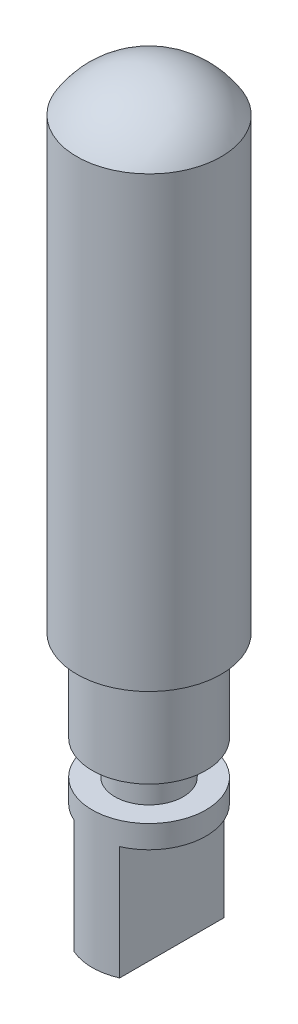
ISO-10303-21;
HEADER;
FILE_DESCRIPTION(('STEP AP214'),'2;1');
FILE_NAME('part.step','',(''),(''),'','','');
FILE_SCHEMA(('AUTOMOTIVE_DESIGN { 1 0 10303 214 1 1 1 1 }'));
ENDSEC;
DATA;
#1=APPLICATION_CONTEXT('core data for automotive mechanical design processes');
#2=APPLICATION_PROTOCOL_DEFINITION('international standard','automotive_design',2000,#1);
#3=PRODUCT_CONTEXT('',#1,'mechanical');
#4=PRODUCT('Part','Part','',(#3));
#5=PRODUCT_RELATED_PRODUCT_CATEGORY('part','',(#4));
#6=PRODUCT_DEFINITION_FORMATION('','',#4);
#7=PRODUCT_DEFINITION_CONTEXT('part definition',#1,'design');
#8=PRODUCT_DEFINITION('design','',#6,#7);
#9=PRODUCT_DEFINITION_SHAPE('','',#8);
#10=(LENGTH_UNIT() NAMED_UNIT(*) SI_UNIT(.MILLI.,.METRE.));
#11=(NAMED_UNIT(*) PLANE_ANGLE_UNIT() SI_UNIT($,.RADIAN.));
#12=(NAMED_UNIT(*) SI_UNIT($,.STERADIAN.) SOLID_ANGLE_UNIT());
#13=UNCERTAINTY_MEASURE_WITH_UNIT(LENGTH_MEASURE(1.E-05),#10,'distance_accuracy_value','');
#14=(GEOMETRIC_REPRESENTATION_CONTEXT(3) GLOBAL_UNCERTAINTY_ASSIGNED_CONTEXT((#13)) GLOBAL_UNIT_ASSIGNED_CONTEXT((#10,
#11,#12)) REPRESENTATION_CONTEXT('',''));
#15=CARTESIAN_POINT('',(0.,0.,0.));
#16=DIRECTION('',(0.,0.,1.));
#17=DIRECTION('',(1.,0.,0.));
#18=AXIS2_PLACEMENT_3D('',#15,#16,#17);
#19=CARTESIAN_POINT('',(0.,-6.5,0.));
#20=DIRECTION('',(0.,-1.,0.));
#21=DIRECTION('',(0.,0.,-1.));
#22=AXIS2_PLACEMENT_3D('',#19,#20,#21);
#23=PLANE('',#22);
#24=CARTESIAN_POINT('',(0.,-6.5,0.));
#25=DIRECTION('',(0.,-1.,0.));
#26=DIRECTION('',(0.,0.,-1.));
#27=AXIS2_PLACEMENT_3D('',#24,#25,#26);
#28=CIRCLE('',#27,2.5);
#29=CARTESIAN_POINT('',(-0.999999999999986,-6.5,-2.29128784747793));
#30=VERTEX_POINT('',#29);
#31=CARTESIAN_POINT('',(-0.999999999999985,-6.5,2.29128784747793));
#32=VERTEX_POINT('',#31);
#33=EDGE_CURVE('E75',#30,#32,#28,.F.);
#34=ORIENTED_EDGE('',*,*,#33,.F.);
#35=DIRECTION('',(0.,0.,-1.));
#36=VECTOR('',#35,1.);
#37=CARTESIAN_POINT('',(-1.,-6.5,-2.291287847478));
#38=LINE('',#37,#36);
#39=EDGE_CURVE('E67',#30,#32,#38,.F.);
#40=ORIENTED_EDGE('',*,*,#39,.T.);
#41=EDGE_LOOP('',(#34,#40));
#42=FACE_BOUND('',#41,.T.);
#43=ADVANCED_FACE('F17',(#42),#23,.T.);
#44=CARTESIAN_POINT('',(-1.,-11.5,-2.291287847478));
#45=DIRECTION('',(1.,0.,0.));
#46=DIRECTION('',(0.,0.,-1.));
#47=AXIS2_PLACEMENT_3D('',#44,#45,#46);
#48=PLANE('',#47);
#49=DIRECTION('',(0.,-1.,0.));
#50=VECTOR('',#49,1.);
#51=CARTESIAN_POINT('',(-0.99999999999997,23.15,2.29128784747793));
#52=LINE('',#51,#50);
#53=CARTESIAN_POINT('',(-0.999999999999985,-11.5,2.29128784747793));
#54=VERTEX_POINT('',#53);
#55=EDGE_CURVE('E105',#32,#54,#52,.T.);
#56=ORIENTED_EDGE('',*,*,#55,.F.);
#57=ORIENTED_EDGE('',*,*,#39,.F.);
#58=DIRECTION('',(0.,-1.,0.));
#59=VECTOR('',#58,1.);
#60=CARTESIAN_POINT('',(-0.999999999999972,23.15,-2.29128784747793));
#61=LINE('',#60,#59);
#62=CARTESIAN_POINT('',(-0.999999999999986,-11.5,-2.29128784747793));
#63=VERTEX_POINT('',#62);
#64=EDGE_CURVE('E71',#63,#30,#61,.F.);
#65=ORIENTED_EDGE('',*,*,#64,.F.);
#66=DIRECTION('',(0.,0.,-1.));
#67=VECTOR('',#66,1.);
#68=CARTESIAN_POINT('',(-1.,-11.5,0.));
#69=LINE('',#68,#67);
#70=EDGE_CURVE('E56',#54,#63,#69,.T.);
#71=ORIENTED_EDGE('',*,*,#70,.F.);
#72=EDGE_LOOP('',(#56,#57,#65,#71));
#73=FACE_BOUND('',#72,.T.);
#74=ADVANCED_FACE('F72',(#73),#48,.F.);
#75=CARTESIAN_POINT('',(0.,-11.5,0.));
#76=DIRECTION('',(0.,-1.,0.));
#77=DIRECTION('',(0.,0.,-1.));
#78=AXIS2_PLACEMENT_3D('',#75,#76,#77);
#79=PLANE('',#78);
#80=ORIENTED_EDGE('',*,*,#70,.T.);
#81=CARTESIAN_POINT('',(0.,-11.5,0.));
#82=DIRECTION('',(0.,-1.,0.));
#83=DIRECTION('',(0.,0.,-1.));
#84=AXIS2_PLACEMENT_3D('',#81,#82,#83);
#85=CIRCLE('',#84,2.5);
#86=CARTESIAN_POINT('',(0.999999999999985,-11.5,-2.29128784747793));
#87=VERTEX_POINT('',#86);
#88=EDGE_CURVE('E20',#87,#63,#85,.F.);
#89=ORIENTED_EDGE('',*,*,#88,.F.);
#90=DIRECTION('',(0.,0.,1.));
#91=VECTOR('',#90,1.);
#92=CARTESIAN_POINT('',(1.,-11.5,2.291287847478));
#93=LINE('',#92,#91);
#94=CARTESIAN_POINT('',(0.999999999999985,-11.5,2.29128784747793));
#95=VERTEX_POINT('',#94);
#96=EDGE_CURVE('E66',#87,#95,#93,.T.);
#97=ORIENTED_EDGE('',*,*,#96,.T.);
#98=CARTESIAN_POINT('',(0.,-11.5,0.));
#99=DIRECTION('',(0.,-1.,0.));
#100=DIRECTION('',(0.,0.,-1.));
#101=AXIS2_PLACEMENT_3D('',#98,#99,#100);
#102=CIRCLE('',#101,2.5);
#103=EDGE_CURVE('E62',#54,#95,#102,.F.);
#104=ORIENTED_EDGE('',*,*,#103,.F.);
#105=EDGE_LOOP('',(#80,#89,#97,#104));
#106=FACE_BOUND('',#105,.T.);
#107=ADVANCED_FACE('F58',(#106),#79,.T.);
#108=CARTESIAN_POINT('',(1.,-11.5,2.291287847478));
#109=DIRECTION('',(-1.,0.,0.));
#110=DIRECTION('',(0.,0.,1.));
#111=AXIS2_PLACEMENT_3D('',#108,#109,#110);
#112=PLANE('',#111);
#113=DIRECTION('',(0.,-1.,0.));
#114=VECTOR('',#113,1.);
#115=CARTESIAN_POINT('',(0.99999999999997,23.15,2.29128784747793));
#116=LINE('',#115,#114);
#117=CARTESIAN_POINT('',(0.999999999999985,-6.5,2.29128784747793));
#118=VERTEX_POINT('',#117);
#119=EDGE_CURVE('E104',#95,#118,#116,.F.);
#120=ORIENTED_EDGE('',*,*,#119,.F.);
#121=ORIENTED_EDGE('',*,*,#96,.F.);
#122=DIRECTION('',(0.,-1.,0.));
#123=VECTOR('',#122,1.);
#124=CARTESIAN_POINT('',(0.999999999999971,23.15,-2.29128784747793));
#125=LINE('',#124,#123);
#126=CARTESIAN_POINT('',(0.999999999999985,-6.5,-2.29128784747793));
#127=VERTEX_POINT('',#126);
#128=EDGE_CURVE('E80',#127,#87,#125,.T.);
#129=ORIENTED_EDGE('',*,*,#128,.F.);
#130=DIRECTION('',(0.,0.,-1.));
#131=VECTOR('',#130,1.);
#132=CARTESIAN_POINT('',(1.,-6.5,0.));
#133=LINE('',#132,#131);
#134=EDGE_CURVE('E35',#118,#127,#133,.T.);
#135=ORIENTED_EDGE('',*,*,#134,.F.);
#136=EDGE_LOOP('',(#120,#121,#129,#135));
#137=FACE_BOUND('',#136,.T.);
#138=ADVANCED_FACE('F135',(#137),#112,.F.);
#139=CARTESIAN_POINT('',(0.,-6.5,0.));
#140=DIRECTION('',(0.,-1.,0.));
#141=DIRECTION('',(0.,0.,-1.));
#142=AXIS2_PLACEMENT_3D('',#139,#140,#141);
#143=PLANE('',#142);
#144=ORIENTED_EDGE('',*,*,#134,.T.);
#145=CARTESIAN_POINT('',(0.,-6.5,0.));
#146=DIRECTION('',(0.,-1.,0.));
#147=DIRECTION('',(0.,0.,-1.));
#148=AXIS2_PLACEMENT_3D('',#145,#146,#147);
#149=CIRCLE('',#148,2.5);
#150=EDGE_CURVE('E102',#118,#127,#149,.F.);
#151=ORIENTED_EDGE('',*,*,#150,.F.);
#152=EDGE_LOOP('',(#144,#151));
#153=FACE_BOUND('',#152,.T.);
#154=ADVANCED_FACE('F137',(#153),#143,.T.);
#155=CARTESIAN_POINT('',(0.,23.15,0.));
#156=DIRECTION('',(0.,-1.,0.));
#157=DIRECTION('',(0.,0.,-1.));
#158=AXIS2_PLACEMENT_3D('',#155,#156,#157);
#159=CYLINDRICAL_SURFACE('',#158,2.5);
#160=CARTESIAN_POINT('',(0.,-5.5,0.));
#161=DIRECTION('',(0.,-1.,0.));
#162=DIRECTION('',(0.,0.,-1.));
#163=AXIS2_PLACEMENT_3D('',#160,#161,#162);
#164=CIRCLE('',#163,2.5);
#165=CARTESIAN_POINT('',(0.,-5.5,-2.5));
#166=VERTEX_POINT('',#165);
#167=EDGE_CURVE('E99',#166,#166,#164,.T.);
#168=ORIENTED_EDGE('',*,*,#167,.T.);
#169=EDGE_LOOP('',(#168));
#170=FACE_BOUND('',#169,.T.);
#171=ORIENTED_EDGE('',*,*,#119,.T.);
#172=ORIENTED_EDGE('',*,*,#150,.T.);
#173=ORIENTED_EDGE('',*,*,#128,.T.);
#174=ORIENTED_EDGE('',*,*,#88,.T.);
#175=ORIENTED_EDGE('',*,*,#64,.T.);
#176=ORIENTED_EDGE('',*,*,#33,.T.);
#177=ORIENTED_EDGE('',*,*,#55,.T.);
#178=ORIENTED_EDGE('',*,*,#103,.T.);
#179=EDGE_LOOP('',(#171,#172,#173,#174,#175,#176,#177,#178));
#180=FACE_BOUND('',#179,.T.);
#181=ADVANCED_FACE('F78',(#170,#180),#159,.T.);
#182=CARTESIAN_POINT('',(0.,-5.5,0.));
#183=DIRECTION('',(0.,-1.,0.));
#184=DIRECTION('',(0.,0.,-1.));
#185=AXIS2_PLACEMENT_3D('',#182,#183,#184);
#186=PLANE('',#185);
#187=CARTESIAN_POINT('',(0.,-5.5,0.));
#188=DIRECTION('',(0.,-1.,0.));
#189=DIRECTION('',(0.,0.,-1.));
#190=AXIS2_PLACEMENT_3D('',#187,#188,#189);
#191=CIRCLE('',#190,1.5);
#192=CARTESIAN_POINT('',(0.,-5.5,-1.5));
#193=VERTEX_POINT('',#192);
#194=EDGE_CURVE('E96',#193,#193,#191,.F.);
#195=ORIENTED_EDGE('',*,*,#194,.F.);
#196=EDGE_LOOP('',(#195));
#197=FACE_BOUND('',#196,.T.);
#198=ORIENTED_EDGE('',*,*,#167,.F.);
#199=EDGE_LOOP('',(#198));
#200=FACE_BOUND('',#199,.T.);
#201=ADVANCED_FACE('F144',(#197,#200),#186,.F.);
#202=CARTESIAN_POINT('',(0.,23.15,0.));
#203=DIRECTION('',(0.,-1.,0.));
#204=DIRECTION('',(0.,0.,-1.));
#205=AXIS2_PLACEMENT_3D('',#202,#203,#204);
#206=CYLINDRICAL_SURFACE('',#205,1.5);
#207=ORIENTED_EDGE('',*,*,#194,.T.);
#208=EDGE_LOOP('',(#207));
#209=FACE_BOUND('',#208,.T.);
#210=CARTESIAN_POINT('',(0.,-4.,0.));
#211=DIRECTION('',(0.,-1.,0.));
#212=DIRECTION('',(0.,0.,-1.));
#213=AXIS2_PLACEMENT_3D('',#210,#211,#212);
#214=CIRCLE('',#213,1.5);
#215=CARTESIAN_POINT('',(0.,-4.,-1.5));
#216=VERTEX_POINT('',#215);
#217=EDGE_CURVE('E93',#216,#216,#214,.F.);
#218=ORIENTED_EDGE('',*,*,#217,.F.);
#219=EDGE_LOOP('',(#218));
#220=FACE_BOUND('',#219,.T.);
#221=ADVANCED_FACE('F177',(#209,#220),#206,.T.);
#222=CARTESIAN_POINT('',(0.,-4.,0.));
#223=DIRECTION('',(0.,-1.,0.));
#224=DIRECTION('',(0.,0.,-1.));
#225=AXIS2_PLACEMENT_3D('',#222,#223,#224);
#226=PLANE('',#225);
#227=ORIENTED_EDGE('',*,*,#217,.T.);
#228=EDGE_LOOP('',(#227));
#229=FACE_BOUND('',#228,.T.);
#230=CARTESIAN_POINT('',(0.,-4.,0.));
#231=DIRECTION('',(0.,-1.,0.));
#232=DIRECTION('',(0.,0.,-1.));
#233=AXIS2_PLACEMENT_3D('',#230,#231,#232);
#234=CIRCLE('',#233,2.5);
#235=CARTESIAN_POINT('',(0.,-4.,-2.5));
#236=VERTEX_POINT('',#235);
#237=EDGE_CURVE('E90',#236,#236,#234,.F.);
#238=ORIENTED_EDGE('',*,*,#237,.F.);
#239=EDGE_LOOP('',(#238));
#240=FACE_BOUND('',#239,.T.);
#241=ADVANCED_FACE('F184',(#229,#240),#226,.T.);
#242=CARTESIAN_POINT('',(0.,23.15,0.));
#243=DIRECTION('',(0.,-1.,0.));
#244=DIRECTION('',(0.,0.,-1.));
#245=AXIS2_PLACEMENT_3D('',#242,#243,#244);
#246=CYLINDRICAL_SURFACE('',#245,2.5);
#247=ORIENTED_EDGE('',*,*,#237,.T.);
#248=EDGE_LOOP('',(#247));
#249=FACE_BOUND('',#248,.T.);
#250=CARTESIAN_POINT('',(0.,0.,0.));
#251=DIRECTION('',(0.,-1.,0.));
#252=DIRECTION('',(0.,0.,-1.));
#253=AXIS2_PLACEMENT_3D('',#250,#251,#252);
#254=CIRCLE('',#253,2.5);
#255=CARTESIAN_POINT('',(0.,0.,-2.5));
#256=VERTEX_POINT('',#255);
#257=EDGE_CURVE('E87',#256,#256,#254,.F.);
#258=ORIENTED_EDGE('',*,*,#257,.F.);
#259=EDGE_LOOP('',(#258));
#260=FACE_BOUND('',#259,.T.);
#261=ADVANCED_FACE('F130',(#249,#260),#246,.T.);
#262=CARTESIAN_POINT('',(0.,17.79982638889,0.));
#263=DIRECTION('',(-1.,0.,0.));
#264=DIRECTION('',(0.,0.,-1.));
#265=AXIS2_PLACEMENT_3D('',#262,#263,#264);
#266=SPHERICAL_SURFACE('',#265,3.700173611111);
#267=CARTESIAN_POINT('',(0.,19.7,0.));
#268=DIRECTION('',(0.,-1.,0.));
#269=DIRECTION('',(0.,0.,-1.));
#270=AXIS2_PLACEMENT_3D('',#267,#268,#269);
#271=CIRCLE('',#270,3.175);
#272=CARTESIAN_POINT('',(0.,19.7,-3.175));
#273=VERTEX_POINT('',#272);
#274=EDGE_CURVE('E26',#273,#273,#271,.T.);
#275=ORIENTED_EDGE('',*,*,#274,.F.);
#276=EDGE_LOOP('',(#275));
#277=FACE_BOUND('',#276,.T.);
#278=ADVANCED_FACE('F122',(#277),#266,.T.);
#279=CARTESIAN_POINT('',(0.,0.,0.));
#280=DIRECTION('',(0.,-1.,0.));
#281=DIRECTION('',(0.,0.,-1.));
#282=AXIS2_PLACEMENT_3D('',#279,#280,#281);
#283=PLANE('',#282);
#284=ORIENTED_EDGE('',*,*,#257,.T.);
#285=EDGE_LOOP('',(#284));
#286=FACE_BOUND('',#285,.T.);
#287=CARTESIAN_POINT('',(0.,0.,0.));
#288=DIRECTION('',(0.,-1.,0.));
#289=DIRECTION('',(0.,0.,-1.));
#290=AXIS2_PLACEMENT_3D('',#287,#288,#289);
#291=CIRCLE('',#290,3.175);
#292=CARTESIAN_POINT('',(0.,0.,-3.175));
#293=VERTEX_POINT('',#292);
#294=EDGE_CURVE('E11',#293,#293,#291,.F.);
#295=ORIENTED_EDGE('',*,*,#294,.F.);
#296=EDGE_LOOP('',(#295));
#297=FACE_BOUND('',#296,.T.);
#298=ADVANCED_FACE('F116',(#286,#297),#283,.T.);
#299=CARTESIAN_POINT('',(0.,23.15,0.));
#300=DIRECTION('',(0.,-1.,0.));
#301=DIRECTION('',(0.,0.,-1.));
#302=AXIS2_PLACEMENT_3D('',#299,#300,#301);
#303=CYLINDRICAL_SURFACE('',#302,3.175);
#304=ORIENTED_EDGE('',*,*,#294,.T.);
#305=EDGE_LOOP('',(#304));
#306=FACE_BOUND('',#305,.T.);
#307=ORIENTED_EDGE('',*,*,#274,.T.);
#308=EDGE_LOOP('',(#307));
#309=FACE_BOUND('',#308,.T.);
#310=ADVANCED_FACE('F114',(#306,#309),#303,.T.);
#311=CLOSED_SHELL('',(#43,#74,#107,#138,#154,#181,#201,#221,#241,#261,#278,#298,#310));
#312=MANIFOLD_SOLID_BREP('B1',#311);
#313=ADVANCED_BREP_SHAPE_REPRESENTATION('',(#18,#312),#14);
#314=SHAPE_DEFINITION_REPRESENTATION(#9,#313);
ENDSEC;
END-ISO-10303-21;
